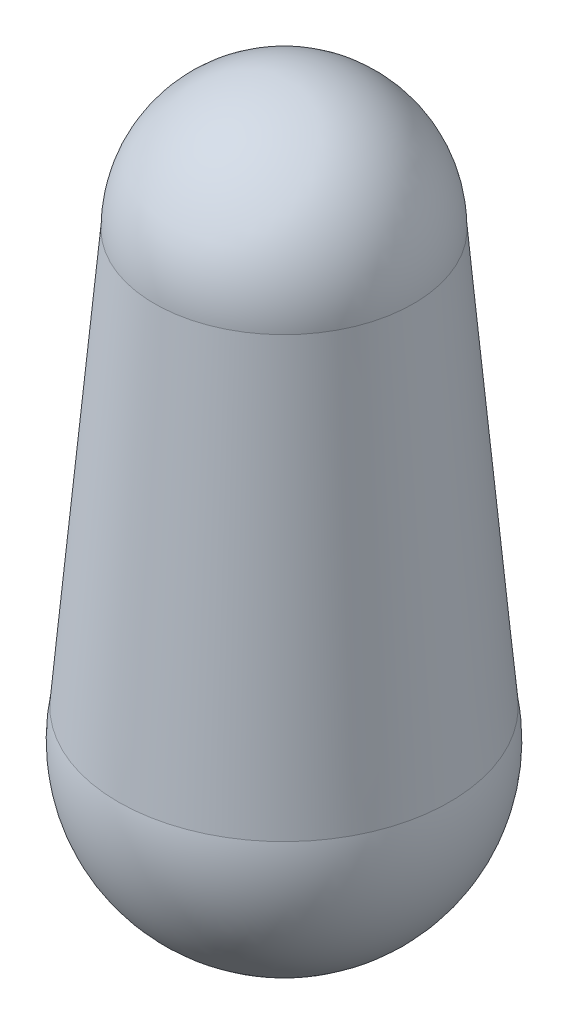
ISO-10303-21;
HEADER;
FILE_DESCRIPTION(('STEP AP214'),'2;1');
FILE_NAME('part.step','',(''),(''),'','','');
FILE_SCHEMA(('AUTOMOTIVE_DESIGN { 1 0 10303 214 1 1 1 1 }'));
ENDSEC;
DATA;
#1=APPLICATION_CONTEXT('core data for automotive mechanical design processes');
#2=APPLICATION_PROTOCOL_DEFINITION('international standard','automotive_design',2000,#1);
#3=PRODUCT_CONTEXT('',#1,'mechanical');
#4=PRODUCT('Part','Part','',(#3));
#5=PRODUCT_RELATED_PRODUCT_CATEGORY('part','',(#4));
#6=PRODUCT_DEFINITION_FORMATION('','',#4);
#7=PRODUCT_DEFINITION_CONTEXT('part definition',#1,'design');
#8=PRODUCT_DEFINITION('design','',#6,#7);
#9=PRODUCT_DEFINITION_SHAPE('','',#8);
#10=(LENGTH_UNIT() NAMED_UNIT(*) SI_UNIT(.MILLI.,.METRE.));
#11=(NAMED_UNIT(*) PLANE_ANGLE_UNIT() SI_UNIT($,.RADIAN.));
#12=(NAMED_UNIT(*) SI_UNIT($,.STERADIAN.) SOLID_ANGLE_UNIT());
#13=UNCERTAINTY_MEASURE_WITH_UNIT(LENGTH_MEASURE(1.E-05),#10,'distance_accuracy_value','');
#14=(GEOMETRIC_REPRESENTATION_CONTEXT(3) GLOBAL_UNCERTAINTY_ASSIGNED_CONTEXT((#13)) GLOBAL_UNIT_ASSIGNED_CONTEXT((#10,
#11,#12)) REPRESENTATION_CONTEXT('',''));
#15=CARTESIAN_POINT('',(0.,0.,0.));
#16=DIRECTION('',(0.,0.,1.));
#17=DIRECTION('',(1.,0.,0.));
#18=AXIS2_PLACEMENT_3D('',#15,#16,#17);
#19=CARTESIAN_POINT('',(0.,0.,0.));
#20=DIRECTION('',(0.,0.,1.));
#21=DIRECTION('',(1.,0.,0.));
#22=AXIS2_PLACEMENT_3D('',#19,#20,#21);
#23=SPHERICAL_SURFACE('',#22,3.8);
#24=CARTESIAN_POINT('',(0.,0.,0.));
#25=DIRECTION('',(0.,1.,0.));
#26=DIRECTION('',(0.,0.,1.));
#27=AXIS2_PLACEMENT_3D('',#24,#25,#26);
#28=SPHERICAL_SURFACE('',#27,3.8);
#29=CARTESIAN_POINT('',(0.,0.659863075134187,0.));
#30=DIRECTION('',(0.,1.,0.));
#31=DIRECTION('',(0.,0.,1.));
#32=AXIS2_PLACEMENT_3D('',#29,#30,#31);
#33=CIRCLE('',#32,3.7422694614464);
#34=CARTESIAN_POINT('',(0.,0.659863075134187,3.7422694614464));
#35=VERTEX_POINT('',#34);
#36=EDGE_CURVE('E10',#35,#35,#33,.F.);
#37=ORIENTED_EDGE('',*,*,#36,.T.);
#38=EDGE_LOOP('',(#37));
#39=FACE_BOUND('',#38,.T.);
#40=ADVANCED_FACE('F35',(#39),#28,.T.);
#41=CARTESIAN_POINT('',(0.,0.,0.));
#42=DIRECTION('',(0.,-1.,0.));
#43=DIRECTION('',(0.,0.,-1.));
#44=AXIS2_PLACEMENT_3D('',#41,#42,#43);
#45=CONICAL_SURFACE('',#44,3.8,0.0872664625997165);
#46=CARTESIAN_POINT('',(0.,10.,0.));
#47=DIRECTION('',(0.,-1.,0.));
#48=DIRECTION('',(0.,0.,-1.));
#49=AXIS2_PLACEMENT_3D('',#46,#47,#48);
#50=CIRCLE('',#49,2.92511336474076);
#51=CARTESIAN_POINT('',(0.,10.,-2.92511336474076));
#52=VERTEX_POINT('',#51);
#53=EDGE_CURVE('E41',#52,#52,#50,.T.);
#54=ORIENTED_EDGE('',*,*,#53,.T.);
#55=EDGE_LOOP('',(#54));
#56=FACE_BOUND('',#55,.T.);
#57=ORIENTED_EDGE('',*,*,#36,.F.);
#58=EDGE_LOOP('',(#57));
#59=FACE_BOUND('',#58,.T.);
#60=ADVANCED_FACE('F47',(#56,#59),#45,.T.);
#61=CARTESIAN_POINT('',(0.,10.,0.));
#62=DIRECTION('',(0.,0.,1.));
#63=DIRECTION('',(1.,0.,0.));
#64=AXIS2_PLACEMENT_3D('',#61,#62,#63);
#65=SPHERICAL_SURFACE('',#64,2.92511336474076);
#66=CARTESIAN_POINT('',(0.,10.,0.));
#67=DIRECTION('',(0.,-1.,0.));
#68=DIRECTION('',(0.,0.,-1.));
#69=AXIS2_PLACEMENT_3D('',#66,#67,#68);
#70=SPHERICAL_SURFACE('',#69,2.92511336474076);
#71=ORIENTED_EDGE('',*,*,#53,.F.);
#72=EDGE_LOOP('',(#71));
#73=FACE_BOUND('',#72,.T.);
#74=ADVANCED_FACE('F50',(#73),#70,.T.);
#75=CLOSED_SHELL('',(#40,#60,#74));
#76=MANIFOLD_SOLID_BREP('B2',#75);
#77=ADVANCED_BREP_SHAPE_REPRESENTATION('',(#18,#76),#14);
#78=SHAPE_DEFINITION_REPRESENTATION(#9,#77);
ENDSEC;
END-ISO-10303-21;
